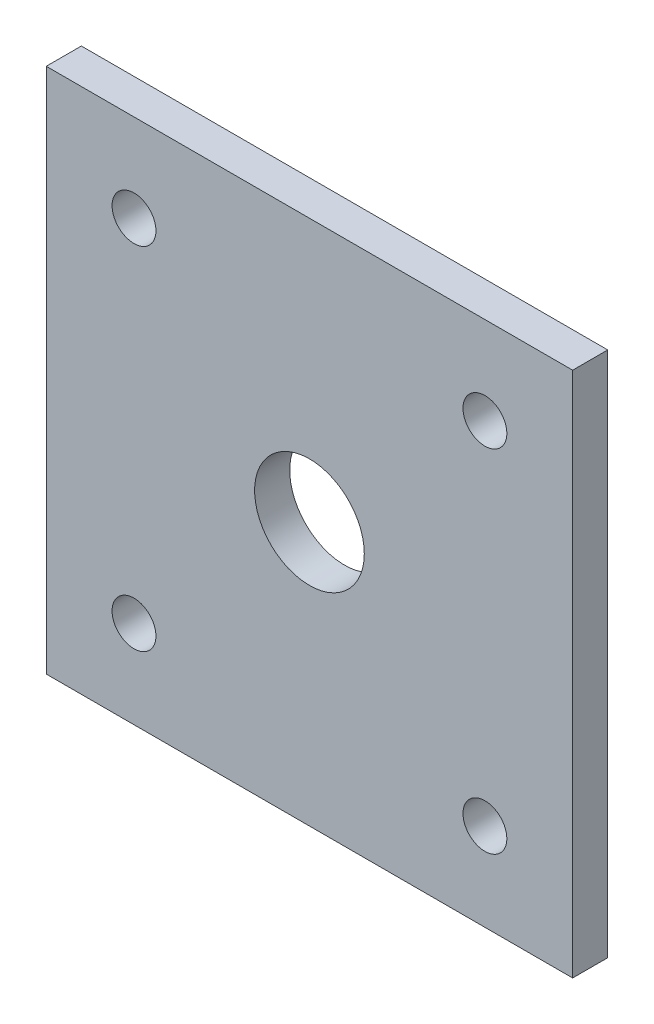
ISO-10303-21;
HEADER;
FILE_DESCRIPTION(('STEP AP214'),'2;1');
FILE_NAME('part.step','',(''),(''),'','','');
FILE_SCHEMA(('AUTOMOTIVE_DESIGN { 1 0 10303 214 1 1 1 1 }'));
ENDSEC;
DATA;
#1=APPLICATION_CONTEXT('core data for automotive mechanical design processes');
#2=APPLICATION_PROTOCOL_DEFINITION('international standard','automotive_design',2000,#1);
#3=PRODUCT_CONTEXT('',#1,'mechanical');
#4=PRODUCT('Part','Part','',(#3));
#5=PRODUCT_RELATED_PRODUCT_CATEGORY('part','',(#4));
#6=PRODUCT_DEFINITION_FORMATION('','',#4);
#7=PRODUCT_DEFINITION_CONTEXT('part definition',#1,'design');
#8=PRODUCT_DEFINITION('design','',#6,#7);
#9=PRODUCT_DEFINITION_SHAPE('','',#8);
#10=(LENGTH_UNIT() NAMED_UNIT(*) SI_UNIT(.MILLI.,.METRE.));
#11=(NAMED_UNIT(*) PLANE_ANGLE_UNIT() SI_UNIT($,.RADIAN.));
#12=(NAMED_UNIT(*) SI_UNIT($,.STERADIAN.) SOLID_ANGLE_UNIT());
#13=UNCERTAINTY_MEASURE_WITH_UNIT(LENGTH_MEASURE(1.E-05),#10,'distance_accuracy_value','');
#14=(GEOMETRIC_REPRESENTATION_CONTEXT(3) GLOBAL_UNCERTAINTY_ASSIGNED_CONTEXT((#13)) GLOBAL_UNIT_ASSIGNED_CONTEXT((#10,
#11,#12)) REPRESENTATION_CONTEXT('',''));
#15=CARTESIAN_POINT('',(0.,0.,0.));
#16=DIRECTION('',(0.,0.,1.));
#17=DIRECTION('',(1.,0.,0.));
#18=AXIS2_PLACEMENT_3D('',#15,#16,#17);
#19=CARTESIAN_POINT('',(40.,-40.,0.));
#20=DIRECTION('',(0.,0.,1.));
#21=DIRECTION('',(1.,0.,0.));
#22=AXIS2_PLACEMENT_3D('',#19,#20,#21);
#23=CYLINDRICAL_SURFACE('',#22,5.00000000000001);
#24=CARTESIAN_POINT('',(40.,-40.,0.));
#25=DIRECTION('',(0.,0.,1.));
#26=DIRECTION('',(1.,0.,0.));
#27=AXIS2_PLACEMENT_3D('',#24,#25,#26);
#28=CIRCLE('',#27,5.00000000000001);
#29=CARTESIAN_POINT('',(45.,-40.,0.));
#30=VERTEX_POINT('',#29);
#31=EDGE_CURVE('E41',#30,#30,#28,.T.);
#32=ORIENTED_EDGE('',*,*,#31,.F.);
#33=EDGE_LOOP('',(#32));
#34=FACE_BOUND('',#33,.T.);
#35=CARTESIAN_POINT('',(40.,-40.,8.));
#36=DIRECTION('',(0.,0.,1.));
#37=DIRECTION('',(1.,0.,0.));
#38=AXIS2_PLACEMENT_3D('',#35,#36,#37);
#39=CIRCLE('',#38,5.00000000000001);
#40=CARTESIAN_POINT('',(45.,-40.,8.));
#41=VERTEX_POINT('',#40);
#42=EDGE_CURVE('E11',#41,#41,#39,.T.);
#43=ORIENTED_EDGE('',*,*,#42,.T.);
#44=EDGE_LOOP('',(#43));
#45=FACE_BOUND('',#44,.T.);
#46=ADVANCED_FACE('F33',(#34,#45),#23,.F.);
#47=CARTESIAN_POINT('',(-40.,-40.,0.));
#48=DIRECTION('',(0.,0.,1.));
#49=DIRECTION('',(1.,0.,0.));
#50=AXIS2_PLACEMENT_3D('',#47,#48,#49);
#51=CYLINDRICAL_SURFACE('',#50,5.00000000000001);
#52=CARTESIAN_POINT('',(-40.,-40.,0.));
#53=DIRECTION('',(0.,0.,1.));
#54=DIRECTION('',(1.,0.,0.));
#55=AXIS2_PLACEMENT_3D('',#52,#53,#54);
#56=CIRCLE('',#55,5.00000000000001);
#57=CARTESIAN_POINT('',(-35.,-40.,0.));
#58=VERTEX_POINT('',#57);
#59=EDGE_CURVE('E111',#58,#58,#56,.T.);
#60=ORIENTED_EDGE('',*,*,#59,.F.);
#61=EDGE_LOOP('',(#60));
#62=FACE_BOUND('',#61,.T.);
#63=CARTESIAN_POINT('',(-40.,-40.,8.));
#64=DIRECTION('',(0.,0.,1.));
#65=DIRECTION('',(1.,0.,0.));
#66=AXIS2_PLACEMENT_3D('',#63,#64,#65);
#67=CIRCLE('',#66,5.00000000000001);
#68=CARTESIAN_POINT('',(-35.,-40.,8.));
#69=VERTEX_POINT('',#68);
#70=EDGE_CURVE('E114',#69,#69,#67,.T.);
#71=ORIENTED_EDGE('',*,*,#70,.T.);
#72=EDGE_LOOP('',(#71));
#73=FACE_BOUND('',#72,.T.);
#74=ADVANCED_FACE('F123',(#62,#73),#51,.F.);
#75=CARTESIAN_POINT('',(60.,-60.,8.));
#76=DIRECTION('',(-1.,0.,0.));
#77=DIRECTION('',(0.,0.,1.));
#78=AXIS2_PLACEMENT_3D('',#75,#76,#77);
#79=PLANE('',#78);
#80=DIRECTION('',(0.,1.,0.));
#81=VECTOR('',#80,1.);
#82=CARTESIAN_POINT('',(60.,-60.,0.));
#83=LINE('',#82,#81);
#84=CARTESIAN_POINT('',(60.,-60.,0.));
#85=VERTEX_POINT('',#84);
#86=CARTESIAN_POINT('',(60.,60.,0.));
#87=VERTEX_POINT('',#86);
#88=EDGE_CURVE('E101',#85,#87,#83,.T.);
#89=ORIENTED_EDGE('',*,*,#88,.T.);
#90=DIRECTION('',(0.,0.,-1.));
#91=VECTOR('',#90,1.);
#92=CARTESIAN_POINT('',(60.,60.,8.));
#93=LINE('',#92,#91);
#94=CARTESIAN_POINT('',(60.,60.,8.));
#95=VERTEX_POINT('',#94);
#96=EDGE_CURVE('E92',#95,#87,#93,.T.);
#97=ORIENTED_EDGE('',*,*,#96,.F.);
#98=DIRECTION('',(0.,1.,0.));
#99=VECTOR('',#98,1.);
#100=CARTESIAN_POINT('',(60.,-60.,8.));
#101=LINE('',#100,#99);
#102=CARTESIAN_POINT('',(60.,-60.,8.));
#103=VERTEX_POINT('',#102);
#104=EDGE_CURVE('E86',#103,#95,#101,.T.);
#105=ORIENTED_EDGE('',*,*,#104,.F.);
#106=DIRECTION('',(0.,0.,-1.));
#107=VECTOR('',#106,1.);
#108=CARTESIAN_POINT('',(60.,-60.,8.));
#109=LINE('',#108,#107);
#110=EDGE_CURVE('E97',#103,#85,#109,.T.);
#111=ORIENTED_EDGE('',*,*,#110,.T.);
#112=EDGE_LOOP('',(#89,#97,#105,#111));
#113=FACE_BOUND('',#112,.T.);
#114=ADVANCED_FACE('F147',(#113),#79,.F.);
#115=CARTESIAN_POINT('',(-60.,60.,8.));
#116=DIRECTION('',(0.,-1.,0.));
#117=DIRECTION('',(0.,0.,-1.));
#118=AXIS2_PLACEMENT_3D('',#115,#116,#117);
#119=PLANE('',#118);
#120=DIRECTION('',(-1.,0.,0.));
#121=VECTOR('',#120,1.);
#122=CARTESIAN_POINT('',(-60.,60.,0.));
#123=LINE('',#122,#121);
#124=CARTESIAN_POINT('',(-60.,60.,0.));
#125=VERTEX_POINT('',#124);
#126=EDGE_CURVE('E91',#87,#125,#123,.T.);
#127=ORIENTED_EDGE('',*,*,#126,.T.);
#128=DIRECTION('',(0.,0.,-1.));
#129=VECTOR('',#128,1.);
#130=CARTESIAN_POINT('',(-60.,60.,8.));
#131=LINE('',#130,#129);
#132=CARTESIAN_POINT('',(-60.,60.,8.));
#133=VERTEX_POINT('',#132);
#134=EDGE_CURVE('E89',#133,#125,#131,.T.);
#135=ORIENTED_EDGE('',*,*,#134,.F.);
#136=DIRECTION('',(-1.,0.,0.));
#137=VECTOR('',#136,1.);
#138=CARTESIAN_POINT('',(-60.,60.,8.));
#139=LINE('',#138,#137);
#140=EDGE_CURVE('E80',#95,#133,#139,.T.);
#141=ORIENTED_EDGE('',*,*,#140,.F.);
#142=ORIENTED_EDGE('',*,*,#96,.T.);
#143=EDGE_LOOP('',(#127,#135,#141,#142));
#144=FACE_BOUND('',#143,.T.);
#145=ADVANCED_FACE('F90',(#144),#119,.F.);
#146=CARTESIAN_POINT('',(-60.,-60.,8.));
#147=DIRECTION('',(1.,0.,0.));
#148=DIRECTION('',(0.,0.,-1.));
#149=AXIS2_PLACEMENT_3D('',#146,#147,#148);
#150=PLANE('',#149);
#151=DIRECTION('',(0.,-1.,0.));
#152=VECTOR('',#151,1.);
#153=CARTESIAN_POINT('',(-60.,-60.,0.));
#154=LINE('',#153,#152);
#155=CARTESIAN_POINT('',(-60.,-60.,0.));
#156=VERTEX_POINT('',#155);
#157=EDGE_CURVE('E66',#125,#156,#154,.T.);
#158=ORIENTED_EDGE('',*,*,#157,.T.);
#159=DIRECTION('',(0.,0.,-1.));
#160=VECTOR('',#159,1.);
#161=CARTESIAN_POINT('',(-60.,-60.,8.));
#162=LINE('',#161,#160);
#163=CARTESIAN_POINT('',(-60.,-60.,8.));
#164=VERTEX_POINT('',#163);
#165=EDGE_CURVE('E93',#164,#156,#162,.T.);
#166=ORIENTED_EDGE('',*,*,#165,.F.);
#167=DIRECTION('',(0.,-1.,0.));
#168=VECTOR('',#167,1.);
#169=CARTESIAN_POINT('',(-60.,-60.,8.));
#170=LINE('',#169,#168);
#171=EDGE_CURVE('E84',#133,#164,#170,.T.);
#172=ORIENTED_EDGE('',*,*,#171,.F.);
#173=ORIENTED_EDGE('',*,*,#134,.T.);
#174=EDGE_LOOP('',(#158,#166,#172,#173));
#175=FACE_BOUND('',#174,.T.);
#176=ADVANCED_FACE('F95',(#175),#150,.F.);
#177=CARTESIAN_POINT('',(-60.,-60.,8.));
#178=DIRECTION('',(0.,1.,0.));
#179=DIRECTION('',(0.,0.,1.));
#180=AXIS2_PLACEMENT_3D('',#177,#178,#179);
#181=PLANE('',#180);
#182=DIRECTION('',(1.,0.,0.));
#183=VECTOR('',#182,1.);
#184=CARTESIAN_POINT('',(-60.,-60.,0.));
#185=LINE('',#184,#183);
#186=EDGE_CURVE('E72',#156,#85,#185,.T.);
#187=ORIENTED_EDGE('',*,*,#186,.T.);
#188=ORIENTED_EDGE('',*,*,#110,.F.);
#189=DIRECTION('',(1.,0.,0.));
#190=VECTOR('',#189,1.);
#191=CARTESIAN_POINT('',(-60.,-60.,8.));
#192=LINE('',#191,#190);
#193=EDGE_CURVE('E49',#164,#103,#192,.T.);
#194=ORIENTED_EDGE('',*,*,#193,.F.);
#195=ORIENTED_EDGE('',*,*,#165,.T.);
#196=EDGE_LOOP('',(#187,#188,#194,#195));
#197=FACE_BOUND('',#196,.T.);
#198=ADVANCED_FACE('F127',(#197),#181,.F.);
#199=CARTESIAN_POINT('',(0.,0.,8.));
#200=DIRECTION('',(0.,0.,-1.));
#201=DIRECTION('',(-1.,0.,0.));
#202=AXIS2_PLACEMENT_3D('',#199,#200,#201);
#203=PLANE('',#202);
#204=CARTESIAN_POINT('',(40.,40.,8.));
#205=DIRECTION('',(0.,0.,1.));
#206=DIRECTION('',(1.,0.,0.));
#207=AXIS2_PLACEMENT_3D('',#204,#205,#206);
#208=CIRCLE('',#207,5.00000000000001);
#209=CARTESIAN_POINT('',(45.,40.,8.));
#210=VERTEX_POINT('',#209);
#211=EDGE_CURVE('E228',#210,#210,#208,.T.);
#212=ORIENTED_EDGE('',*,*,#211,.F.);
#213=EDGE_LOOP('',(#212));
#214=FACE_BOUND('',#213,.T.);
#215=CARTESIAN_POINT('',(-40.,40.,8.));
#216=DIRECTION('',(0.,0.,1.));
#217=DIRECTION('',(1.,0.,0.));
#218=AXIS2_PLACEMENT_3D('',#215,#216,#217);
#219=CIRCLE('',#218,5.00000000000001);
#220=CARTESIAN_POINT('',(-35.,40.,8.));
#221=VERTEX_POINT('',#220);
#222=EDGE_CURVE('E229',#221,#221,#219,.T.);
#223=ORIENTED_EDGE('',*,*,#222,.F.);
#224=EDGE_LOOP('',(#223));
#225=FACE_BOUND('',#224,.T.);
#226=CARTESIAN_POINT('',(0.,0.,8.));
#227=DIRECTION('',(0.,0.,1.));
#228=DIRECTION('',(1.,0.,0.));
#229=AXIS2_PLACEMENT_3D('',#226,#227,#228);
#230=CIRCLE('',#229,12.5);
#231=CARTESIAN_POINT('',(12.5,0.,8.));
#232=VERTEX_POINT('',#231);
#233=EDGE_CURVE('E237',#232,#232,#230,.T.);
#234=ORIENTED_EDGE('',*,*,#233,.F.);
#235=EDGE_LOOP('',(#234));
#236=FACE_BOUND('',#235,.T.);
#237=ORIENTED_EDGE('',*,*,#104,.T.);
#238=ORIENTED_EDGE('',*,*,#140,.T.);
#239=ORIENTED_EDGE('',*,*,#171,.T.);
#240=ORIENTED_EDGE('',*,*,#193,.T.);
#241=EDGE_LOOP('',(#237,#238,#239,#240));
#242=FACE_BOUND('',#241,.T.);
#243=ORIENTED_EDGE('',*,*,#70,.F.);
#244=EDGE_LOOP('',(#243));
#245=FACE_BOUND('',#244,.T.);
#246=ORIENTED_EDGE('',*,*,#42,.F.);
#247=EDGE_LOOP('',(#246));
#248=FACE_BOUND('',#247,.T.);
#249=ADVANCED_FACE('F81',(#214,#225,#236,#242,#245,#248),#203,.F.);
#250=CARTESIAN_POINT('',(0.,0.,0.));
#251=DIRECTION('',(0.,0.,-1.));
#252=DIRECTION('',(-1.,0.,0.));
#253=AXIS2_PLACEMENT_3D('',#250,#251,#252);
#254=PLANE('',#253);
#255=CARTESIAN_POINT('',(40.,40.,0.));
#256=DIRECTION('',(0.,0.,1.));
#257=DIRECTION('',(1.,0.,0.));
#258=AXIS2_PLACEMENT_3D('',#255,#256,#257);
#259=CIRCLE('',#258,5.00000000000001);
#260=CARTESIAN_POINT('',(45.,40.,0.));
#261=VERTEX_POINT('',#260);
#262=EDGE_CURVE('E226',#261,#261,#259,.T.);
#263=ORIENTED_EDGE('',*,*,#262,.T.);
#264=EDGE_LOOP('',(#263));
#265=FACE_BOUND('',#264,.T.);
#266=CARTESIAN_POINT('',(-40.,40.,0.));
#267=DIRECTION('',(0.,0.,1.));
#268=DIRECTION('',(1.,0.,0.));
#269=AXIS2_PLACEMENT_3D('',#266,#267,#268);
#270=CIRCLE('',#269,5.00000000000001);
#271=CARTESIAN_POINT('',(-35.,40.,0.));
#272=VERTEX_POINT('',#271);
#273=EDGE_CURVE('E232',#272,#272,#270,.T.);
#274=ORIENTED_EDGE('',*,*,#273,.T.);
#275=EDGE_LOOP('',(#274));
#276=FACE_BOUND('',#275,.T.);
#277=CARTESIAN_POINT('',(0.,0.,0.));
#278=DIRECTION('',(0.,0.,1.));
#279=DIRECTION('',(1.,0.,0.));
#280=AXIS2_PLACEMENT_3D('',#277,#278,#279);
#281=CIRCLE('',#280,12.5);
#282=CARTESIAN_POINT('',(12.5,0.,0.));
#283=VERTEX_POINT('',#282);
#284=EDGE_CURVE('E104',#283,#283,#281,.T.);
#285=ORIENTED_EDGE('',*,*,#284,.T.);
#286=EDGE_LOOP('',(#285));
#287=FACE_BOUND('',#286,.T.);
#288=ORIENTED_EDGE('',*,*,#88,.F.);
#289=ORIENTED_EDGE('',*,*,#186,.F.);
#290=ORIENTED_EDGE('',*,*,#157,.F.);
#291=ORIENTED_EDGE('',*,*,#126,.F.);
#292=EDGE_LOOP('',(#288,#289,#290,#291));
#293=FACE_BOUND('',#292,.T.);
#294=ORIENTED_EDGE('',*,*,#59,.T.);
#295=EDGE_LOOP('',(#294));
#296=FACE_BOUND('',#295,.T.);
#297=ORIENTED_EDGE('',*,*,#31,.T.);
#298=EDGE_LOOP('',(#297));
#299=FACE_BOUND('',#298,.T.);
#300=ADVANCED_FACE('F119',(#265,#276,#287,#293,#296,#299),#254,.T.);
#301=CARTESIAN_POINT('',(0.,0.,0.));
#302=DIRECTION('',(0.,0.,1.));
#303=DIRECTION('',(1.,0.,0.));
#304=AXIS2_PLACEMENT_3D('',#301,#302,#303);
#305=CYLINDRICAL_SURFACE('',#304,12.5);
#306=ORIENTED_EDGE('',*,*,#284,.F.);
#307=EDGE_LOOP('',(#306));
#308=FACE_BOUND('',#307,.T.);
#309=ORIENTED_EDGE('',*,*,#233,.T.);
#310=EDGE_LOOP('',(#309));
#311=FACE_BOUND('',#310,.T.);
#312=ADVANCED_FACE('F134',(#308,#311),#305,.F.);
#313=CARTESIAN_POINT('',(-40.,40.,0.));
#314=DIRECTION('',(0.,0.,1.));
#315=DIRECTION('',(1.,0.,0.));
#316=AXIS2_PLACEMENT_3D('',#313,#314,#315);
#317=CYLINDRICAL_SURFACE('',#316,5.00000000000001);
#318=ORIENTED_EDGE('',*,*,#273,.F.);
#319=EDGE_LOOP('',(#318));
#320=FACE_BOUND('',#319,.T.);
#321=ORIENTED_EDGE('',*,*,#222,.T.);
#322=EDGE_LOOP('',(#321));
#323=FACE_BOUND('',#322,.T.);
#324=ADVANCED_FACE('F186',(#320,#323),#317,.F.);
#325=CARTESIAN_POINT('',(40.,40.,0.));
#326=DIRECTION('',(0.,0.,1.));
#327=DIRECTION('',(1.,0.,0.));
#328=AXIS2_PLACEMENT_3D('',#325,#326,#327);
#329=CYLINDRICAL_SURFACE('',#328,5.00000000000001);
#330=ORIENTED_EDGE('',*,*,#262,.F.);
#331=EDGE_LOOP('',(#330));
#332=FACE_BOUND('',#331,.T.);
#333=ORIENTED_EDGE('',*,*,#211,.T.);
#334=EDGE_LOOP('',(#333));
#335=FACE_BOUND('',#334,.T.);
#336=ADVANCED_FACE('F195',(#332,#335),#329,.F.);
#337=CLOSED_SHELL('',(#46,#74,#114,#145,#176,#198,#249,#300,#312,#324,#336));
#338=MANIFOLD_SOLID_BREP('B2',#337);
#339=ADVANCED_BREP_SHAPE_REPRESENTATION('',(#18,#338),#14);
#340=SHAPE_DEFINITION_REPRESENTATION(#9,#339);
ENDSEC;
END-ISO-10303-21;
